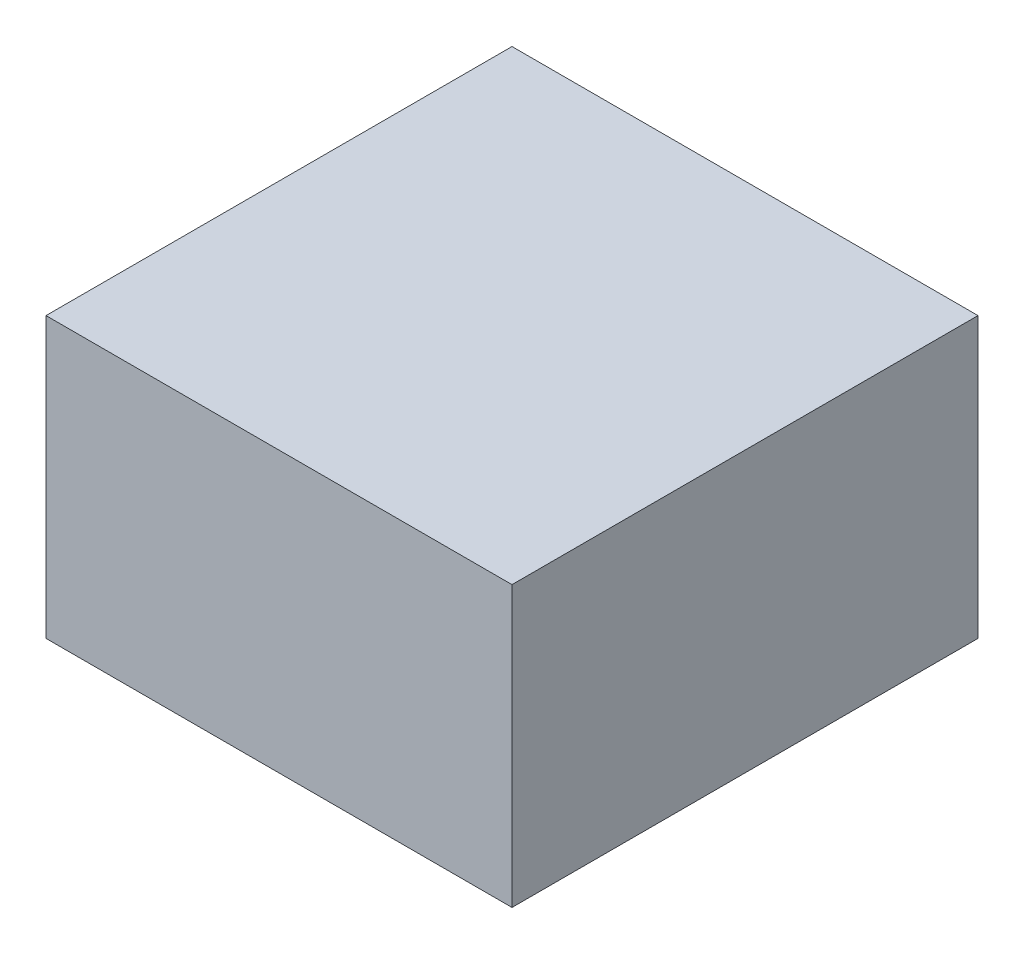
ISO-10303-21;
HEADER;
FILE_DESCRIPTION(('STEP AP214'),'2;1');
FILE_NAME('part.step','',(''),(''),'','','');
FILE_SCHEMA(('AUTOMOTIVE_DESIGN { 1 0 10303 214 1 1 1 1 }'));
ENDSEC;
DATA;
#1=APPLICATION_CONTEXT('core data for automotive mechanical design processes');
#2=APPLICATION_PROTOCOL_DEFINITION('international standard','automotive_design',2000,#1);
#3=PRODUCT_CONTEXT('',#1,'mechanical');
#4=PRODUCT('Part','Part','',(#3));
#5=PRODUCT_RELATED_PRODUCT_CATEGORY('part','',(#4));
#6=PRODUCT_DEFINITION_FORMATION('','',#4);
#7=PRODUCT_DEFINITION_CONTEXT('part definition',#1,'design');
#8=PRODUCT_DEFINITION('design','',#6,#7);
#9=PRODUCT_DEFINITION_SHAPE('','',#8);
#10=(LENGTH_UNIT() NAMED_UNIT(*) SI_UNIT(.MILLI.,.METRE.));
#11=(NAMED_UNIT(*) PLANE_ANGLE_UNIT() SI_UNIT($,.RADIAN.));
#12=(NAMED_UNIT(*) SI_UNIT($,.STERADIAN.) SOLID_ANGLE_UNIT());
#13=UNCERTAINTY_MEASURE_WITH_UNIT(LENGTH_MEASURE(1.E-05),#10,'distance_accuracy_value','');
#14=(GEOMETRIC_REPRESENTATION_CONTEXT(3) GLOBAL_UNCERTAINTY_ASSIGNED_CONTEXT((#13)) GLOBAL_UNIT_ASSIGNED_CONTEXT((#10,
#11,#12)) REPRESENTATION_CONTEXT('',''));
#15=CARTESIAN_POINT('',(0.,0.,0.));
#16=DIRECTION('',(0.,0.,1.));
#17=DIRECTION('',(1.,0.,0.));
#18=AXIS2_PLACEMENT_3D('',#15,#16,#17);
#19=CARTESIAN_POINT('',(31.75,19.05,0.));
#20=DIRECTION('',(0.,0.,-1.));
#21=DIRECTION('',(-1.,0.,0.));
#22=AXIS2_PLACEMENT_3D('',#19,#20,#21);
#23=PLANE('',#22);
#24=DIRECTION('',(1.,0.,0.));
#25=VECTOR('',#24,1.);
#26=CARTESIAN_POINT('',(31.75,0.,0.));
#27=LINE('',#26,#25);
#28=CARTESIAN_POINT('',(0.,0.,0.));
#29=VERTEX_POINT('',#28);
#30=CARTESIAN_POINT('',(31.75,0.,0.));
#31=VERTEX_POINT('',#30);
#32=EDGE_CURVE('E96',#29,#31,#27,.T.);
#33=ORIENTED_EDGE('',*,*,#32,.T.);
#34=DIRECTION('',(0.,-1.,0.));
#35=VECTOR('',#34,1.);
#36=CARTESIAN_POINT('',(31.75,19.05,0.));
#37=LINE('',#36,#35);
#38=CARTESIAN_POINT('',(31.75,19.05,0.));
#39=VERTEX_POINT('',#38);
#40=EDGE_CURVE('E11',#39,#31,#37,.T.);
#41=ORIENTED_EDGE('',*,*,#40,.F.);
#42=DIRECTION('',(1.,0.,0.));
#43=VECTOR('',#42,1.);
#44=CARTESIAN_POINT('',(31.75,19.05,0.));
#45=LINE('',#44,#43);
#46=CARTESIAN_POINT('',(0.,19.05,0.));
#47=VERTEX_POINT('',#46);
#48=EDGE_CURVE('E84',#47,#39,#45,.T.);
#49=ORIENTED_EDGE('',*,*,#48,.F.);
#50=DIRECTION('',(0.,-1.,0.));
#51=VECTOR('',#50,1.);
#52=CARTESIAN_POINT('',(0.,19.05,0.));
#53=LINE('',#52,#51);
#54=EDGE_CURVE('E92',#47,#29,#53,.T.);
#55=ORIENTED_EDGE('',*,*,#54,.T.);
#56=EDGE_LOOP('',(#33,#41,#49,#55));
#57=FACE_BOUND('',#56,.T.);
#58=ADVANCED_FACE('F33',(#57),#23,.F.);
#59=CARTESIAN_POINT('',(31.75,19.05,-31.75));
#60=DIRECTION('',(-1.,0.,0.));
#61=DIRECTION('',(0.,0.,1.));
#62=AXIS2_PLACEMENT_3D('',#59,#60,#61);
#63=PLANE('',#62);
#64=DIRECTION('',(0.,0.,-1.));
#65=VECTOR('',#64,1.);
#66=CARTESIAN_POINT('',(31.75,0.,-31.75));
#67=LINE('',#66,#65);
#68=CARTESIAN_POINT('',(31.75,0.,-31.75));
#69=VERTEX_POINT('',#68);
#70=EDGE_CURVE('E88',#31,#69,#67,.T.);
#71=ORIENTED_EDGE('',*,*,#70,.T.);
#72=DIRECTION('',(0.,-1.,0.));
#73=VECTOR('',#72,1.);
#74=CARTESIAN_POINT('',(31.75,19.05,-31.75));
#75=LINE('',#74,#73);
#76=CARTESIAN_POINT('',(31.75,19.05,-31.75));
#77=VERTEX_POINT('',#76);
#78=EDGE_CURVE('E41',#77,#69,#75,.T.);
#79=ORIENTED_EDGE('',*,*,#78,.F.);
#80=DIRECTION('',(0.,0.,-1.));
#81=VECTOR('',#80,1.);
#82=CARTESIAN_POINT('',(31.75,19.05,-31.75));
#83=LINE('',#82,#81);
#84=EDGE_CURVE('E79',#39,#77,#83,.T.);
#85=ORIENTED_EDGE('',*,*,#84,.F.);
#86=ORIENTED_EDGE('',*,*,#40,.T.);
#87=EDGE_LOOP('',(#71,#79,#85,#86));
#88=FACE_BOUND('',#87,.T.);
#89=ADVANCED_FACE('F87',(#88),#63,.F.);
#90=CARTESIAN_POINT('',(0.,19.05,-31.75));
#91=DIRECTION('',(0.,0.,1.));
#92=DIRECTION('',(1.,0.,0.));
#93=AXIS2_PLACEMENT_3D('',#90,#91,#92);
#94=PLANE('',#93);
#95=DIRECTION('',(-1.,0.,0.));
#96=VECTOR('',#95,1.);
#97=CARTESIAN_POINT('',(0.,0.,-31.75));
#98=LINE('',#97,#96);
#99=CARTESIAN_POINT('',(0.,0.,-31.75));
#100=VERTEX_POINT('',#99);
#101=EDGE_CURVE('E66',#69,#100,#98,.T.);
#102=ORIENTED_EDGE('',*,*,#101,.T.);
#103=DIRECTION('',(0.,-1.,0.));
#104=VECTOR('',#103,1.);
#105=CARTESIAN_POINT('',(0.,19.05,-31.75));
#106=LINE('',#105,#104);
#107=CARTESIAN_POINT('',(0.,19.05,-31.75));
#108=VERTEX_POINT('',#107);
#109=EDGE_CURVE('E89',#108,#100,#106,.T.);
#110=ORIENTED_EDGE('',*,*,#109,.F.);
#111=DIRECTION('',(-1.,0.,0.));
#112=VECTOR('',#111,1.);
#113=CARTESIAN_POINT('',(0.,19.05,-31.75));
#114=LINE('',#113,#112);
#115=EDGE_CURVE('E82',#77,#108,#114,.T.);
#116=ORIENTED_EDGE('',*,*,#115,.F.);
#117=ORIENTED_EDGE('',*,*,#78,.T.);
#118=EDGE_LOOP('',(#102,#110,#116,#117));
#119=FACE_BOUND('',#118,.T.);
#120=ADVANCED_FACE('F90',(#119),#94,.F.);
#121=CARTESIAN_POINT('',(0.,19.05,0.));
#122=DIRECTION('',(1.,0.,0.));
#123=DIRECTION('',(0.,0.,-1.));
#124=AXIS2_PLACEMENT_3D('',#121,#122,#123);
#125=PLANE('',#124);
#126=DIRECTION('',(0.,0.,1.));
#127=VECTOR('',#126,1.);
#128=CARTESIAN_POINT('',(0.,0.,0.));
#129=LINE('',#128,#127);
#130=EDGE_CURVE('E72',#100,#29,#129,.T.);
#131=ORIENTED_EDGE('',*,*,#130,.T.);
#132=ORIENTED_EDGE('',*,*,#54,.F.);
#133=DIRECTION('',(0.,0.,1.));
#134=VECTOR('',#133,1.);
#135=CARTESIAN_POINT('',(0.,19.05,0.));
#136=LINE('',#135,#134);
#137=EDGE_CURVE('E49',#108,#47,#136,.T.);
#138=ORIENTED_EDGE('',*,*,#137,.F.);
#139=ORIENTED_EDGE('',*,*,#109,.T.);
#140=EDGE_LOOP('',(#131,#132,#138,#139));
#141=FACE_BOUND('',#140,.T.);
#142=ADVANCED_FACE('F103',(#141),#125,.F.);
#143=CARTESIAN_POINT('',(0.,19.05,0.));
#144=DIRECTION('',(0.,-1.,0.));
#145=DIRECTION('',(0.,0.,-1.));
#146=AXIS2_PLACEMENT_3D('',#143,#144,#145);
#147=PLANE('',#146);
#148=ORIENTED_EDGE('',*,*,#48,.T.);
#149=ORIENTED_EDGE('',*,*,#84,.T.);
#150=ORIENTED_EDGE('',*,*,#115,.T.);
#151=ORIENTED_EDGE('',*,*,#137,.T.);
#152=EDGE_LOOP('',(#148,#149,#150,#151));
#153=FACE_BOUND('',#152,.T.);
#154=ADVANCED_FACE('F80',(#153),#147,.F.);
#155=CARTESIAN_POINT('',(0.,0.,0.));
#156=DIRECTION('',(0.,-1.,0.));
#157=DIRECTION('',(0.,0.,-1.));
#158=AXIS2_PLACEMENT_3D('',#155,#156,#157);
#159=PLANE('',#158);
#160=ORIENTED_EDGE('',*,*,#32,.F.);
#161=ORIENTED_EDGE('',*,*,#130,.F.);
#162=ORIENTED_EDGE('',*,*,#101,.F.);
#163=ORIENTED_EDGE('',*,*,#70,.F.);
#164=EDGE_LOOP('',(#160,#161,#162,#163));
#165=FACE_BOUND('',#164,.T.);
#166=ADVANCED_FACE('F106',(#165),#159,.T.);
#167=CLOSED_SHELL('',(#58,#89,#120,#142,#154,#166));
#168=MANIFOLD_SOLID_BREP('B2',#167);
#169=ADVANCED_BREP_SHAPE_REPRESENTATION('',(#18,#168),#14);
#170=SHAPE_DEFINITION_REPRESENTATION(#9,#169);
ENDSEC;
END-ISO-10303-21;
